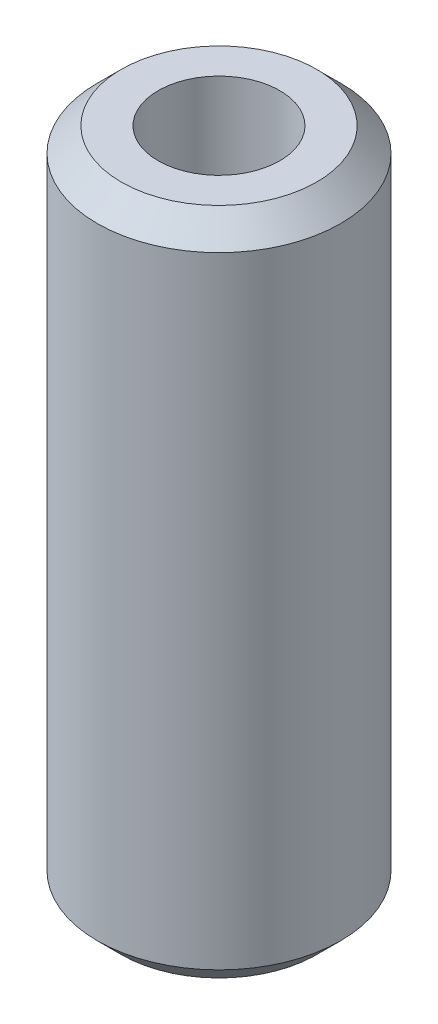
ISO-10303-21;
HEADER;
FILE_DESCRIPTION(('STEP AP214'),'2;1');
FILE_NAME('part.step','',(''),(''),'','','');
FILE_SCHEMA(('AUTOMOTIVE_DESIGN { 1 0 10303 214 1 1 1 1 }'));
ENDSEC;
DATA;
#1=APPLICATION_CONTEXT('core data for automotive mechanical design processes');
#2=APPLICATION_PROTOCOL_DEFINITION('international standard','automotive_design',2000,#1);
#3=PRODUCT_CONTEXT('',#1,'mechanical');
#4=PRODUCT('Part','Part','',(#3));
#5=PRODUCT_RELATED_PRODUCT_CATEGORY('part','',(#4));
#6=PRODUCT_DEFINITION_FORMATION('','',#4);
#7=PRODUCT_DEFINITION_CONTEXT('part definition',#1,'design');
#8=PRODUCT_DEFINITION('design','',#6,#7);
#9=PRODUCT_DEFINITION_SHAPE('','',#8);
#10=(LENGTH_UNIT() NAMED_UNIT(*) SI_UNIT(.MILLI.,.METRE.));
#11=(NAMED_UNIT(*) PLANE_ANGLE_UNIT() SI_UNIT($,.RADIAN.));
#12=(NAMED_UNIT(*) SI_UNIT($,.STERADIAN.) SOLID_ANGLE_UNIT());
#13=UNCERTAINTY_MEASURE_WITH_UNIT(LENGTH_MEASURE(1.E-05),#10,'distance_accuracy_value','');
#14=(GEOMETRIC_REPRESENTATION_CONTEXT(3) GLOBAL_UNCERTAINTY_ASSIGNED_CONTEXT((#13)) GLOBAL_UNIT_ASSIGNED_CONTEXT((#10,
#11,#12)) REPRESENTATION_CONTEXT('',''));
#15=CARTESIAN_POINT('',(0.,0.,0.));
#16=DIRECTION('',(0.,0.,1.));
#17=DIRECTION('',(1.,0.,0.));
#18=AXIS2_PLACEMENT_3D('',#15,#16,#17);
#19=CARTESIAN_POINT('',(0.,34.925,0.));
#20=DIRECTION('',(0.,1.,0.));
#21=DIRECTION('',(0.,0.,1.));
#22=AXIS2_PLACEMENT_3D('',#19,#20,#21);
#23=PLANE('',#22);
#24=CARTESIAN_POINT('',(0.,34.925,0.));
#25=DIRECTION('',(0.,1.,0.));
#26=DIRECTION('',(0.,0.,1.));
#27=AXIS2_PLACEMENT_3D('',#24,#25,#26);
#28=CIRCLE('',#27,10.2);
#29=CARTESIAN_POINT('',(0.,34.925,10.2));
#30=VERTEX_POINT('',#29);
#31=EDGE_CURVE('E10',#30,#30,#28,.T.);
#32=ORIENTED_EDGE('',*,*,#31,.T.);
#33=EDGE_LOOP('',(#32));
#34=FACE_BOUND('',#33,.T.);
#35=CARTESIAN_POINT('',(0.,34.925,0.));
#36=DIRECTION('',(0.,1.,0.));
#37=DIRECTION('',(0.,0.,1.));
#38=AXIS2_PLACEMENT_3D('',#35,#36,#37);
#39=CIRCLE('',#38,6.35);
#40=CARTESIAN_POINT('',(0.,34.925,6.35));
#41=VERTEX_POINT('',#40);
#42=EDGE_CURVE('E70',#41,#41,#39,.T.);
#43=ORIENTED_EDGE('',*,*,#42,.F.);
#44=EDGE_LOOP('',(#43));
#45=FACE_BOUND('',#44,.T.);
#46=ADVANCED_FACE('F45',(#34,#45),#23,.T.);
#47=CARTESIAN_POINT('',(0.,-34.925,0.));
#48=DIRECTION('',(0.,1.,0.));
#49=DIRECTION('',(0.,0.,1.));
#50=AXIS2_PLACEMENT_3D('',#47,#48,#49);
#51=PLANE('',#50);
#52=CARTESIAN_POINT('',(0.,-34.925,0.));
#53=DIRECTION('',(0.,1.,0.));
#54=DIRECTION('',(0.,0.,1.));
#55=AXIS2_PLACEMENT_3D('',#52,#53,#54);
#56=CIRCLE('',#55,10.2);
#57=CARTESIAN_POINT('',(0.,-34.925,10.2));
#58=VERTEX_POINT('',#57);
#59=EDGE_CURVE('E54',#58,#58,#56,.F.);
#60=ORIENTED_EDGE('',*,*,#59,.T.);
#61=EDGE_LOOP('',(#60));
#62=FACE_BOUND('',#61,.T.);
#63=CARTESIAN_POINT('',(0.,-34.925,0.));
#64=DIRECTION('',(0.,1.,0.));
#65=DIRECTION('',(0.,0.,1.));
#66=AXIS2_PLACEMENT_3D('',#63,#64,#65);
#67=CIRCLE('',#66,6.35);
#68=CARTESIAN_POINT('',(0.,-34.925,6.35));
#69=VERTEX_POINT('',#68);
#70=EDGE_CURVE('E71',#69,#69,#67,.T.);
#71=ORIENTED_EDGE('',*,*,#70,.T.);
#72=EDGE_LOOP('',(#71));
#73=FACE_BOUND('',#72,.T.);
#74=ADVANCED_FACE('F83',(#62,#73),#51,.F.);
#75=CARTESIAN_POINT('',(0.,34.925,0.));
#76=DIRECTION('',(0.,-1.,0.));
#77=DIRECTION('',(0.,0.,-1.));
#78=AXIS2_PLACEMENT_3D('',#75,#76,#77);
#79=CYLINDRICAL_SURFACE('',#78,12.7);
#80=CARTESIAN_POINT('',(0.,-32.425,0.));
#81=DIRECTION('',(0.,1.,0.));
#82=DIRECTION('',(0.,0.,1.));
#83=AXIS2_PLACEMENT_3D('',#80,#81,#82);
#84=CIRCLE('',#83,12.7);
#85=CARTESIAN_POINT('',(0.,-32.425,12.7));
#86=VERTEX_POINT('',#85);
#87=EDGE_CURVE('E59',#86,#86,#84,.T.);
#88=ORIENTED_EDGE('',*,*,#87,.T.);
#89=EDGE_LOOP('',(#88));
#90=FACE_BOUND('',#89,.T.);
#91=CARTESIAN_POINT('',(0.,32.425,0.));
#92=DIRECTION('',(0.,1.,0.));
#93=DIRECTION('',(0.,0.,1.));
#94=AXIS2_PLACEMENT_3D('',#91,#92,#93);
#95=CIRCLE('',#94,12.7);
#96=CARTESIAN_POINT('',(0.,32.425,12.7));
#97=VERTEX_POINT('',#96);
#98=EDGE_CURVE('E64',#97,#97,#95,.F.);
#99=ORIENTED_EDGE('',*,*,#98,.T.);
#100=EDGE_LOOP('',(#99));
#101=FACE_BOUND('',#100,.T.);
#102=ADVANCED_FACE('F88',(#90,#101),#79,.T.);
#103=CARTESIAN_POINT('',(0.,34.925,0.));
#104=DIRECTION('',(0.,-1.,0.));
#105=DIRECTION('',(0.,0.,-1.));
#106=AXIS2_PLACEMENT_3D('',#103,#104,#105);
#107=CYLINDRICAL_SURFACE('',#106,6.35);
#108=ORIENTED_EDGE('',*,*,#42,.T.);
#109=EDGE_LOOP('',(#108));
#110=FACE_BOUND('',#109,.T.);
#111=ORIENTED_EDGE('',*,*,#70,.F.);
#112=EDGE_LOOP('',(#111));
#113=FACE_BOUND('',#112,.T.);
#114=ADVANCED_FACE('F79',(#110,#113),#107,.F.);
#115=CARTESIAN_POINT('',(0.,-32.425,0.));
#116=DIRECTION('',(0.,1.,0.));
#117=DIRECTION('',(0.,0.,1.));
#118=AXIS2_PLACEMENT_3D('',#115,#116,#117);
#119=CONICAL_SURFACE('',#118,12.7,0.785398163397449);
#120=ORIENTED_EDGE('',*,*,#59,.F.);
#121=EDGE_LOOP('',(#120));
#122=FACE_BOUND('',#121,.T.);
#123=ORIENTED_EDGE('',*,*,#87,.F.);
#124=EDGE_LOOP('',(#123));
#125=FACE_BOUND('',#124,.T.);
#126=ADVANCED_FACE('F95',(#122,#125),#119,.T.);
#127=CARTESIAN_POINT('',(0.,34.925,0.));
#128=DIRECTION('',(0.,-1.,0.));
#129=DIRECTION('',(0.,0.,-1.));
#130=AXIS2_PLACEMENT_3D('',#127,#128,#129);
#131=CONICAL_SURFACE('',#130,10.2,0.785398163397446);
#132=ORIENTED_EDGE('',*,*,#98,.F.);
#133=EDGE_LOOP('',(#132));
#134=FACE_BOUND('',#133,.T.);
#135=ORIENTED_EDGE('',*,*,#31,.F.);
#136=EDGE_LOOP('',(#135));
#137=FACE_BOUND('',#136,.T.);
#138=ADVANCED_FACE('F48',(#134,#137),#131,.T.);
#139=CLOSED_SHELL('',(#46,#74,#102,#114,#126,#138));
#140=MANIFOLD_SOLID_BREP('B2',#139);
#141=ADVANCED_BREP_SHAPE_REPRESENTATION('',(#18,#140),#14);
#142=SHAPE_DEFINITION_REPRESENTATION(#9,#141);
ENDSEC;
END-ISO-10303-21;
